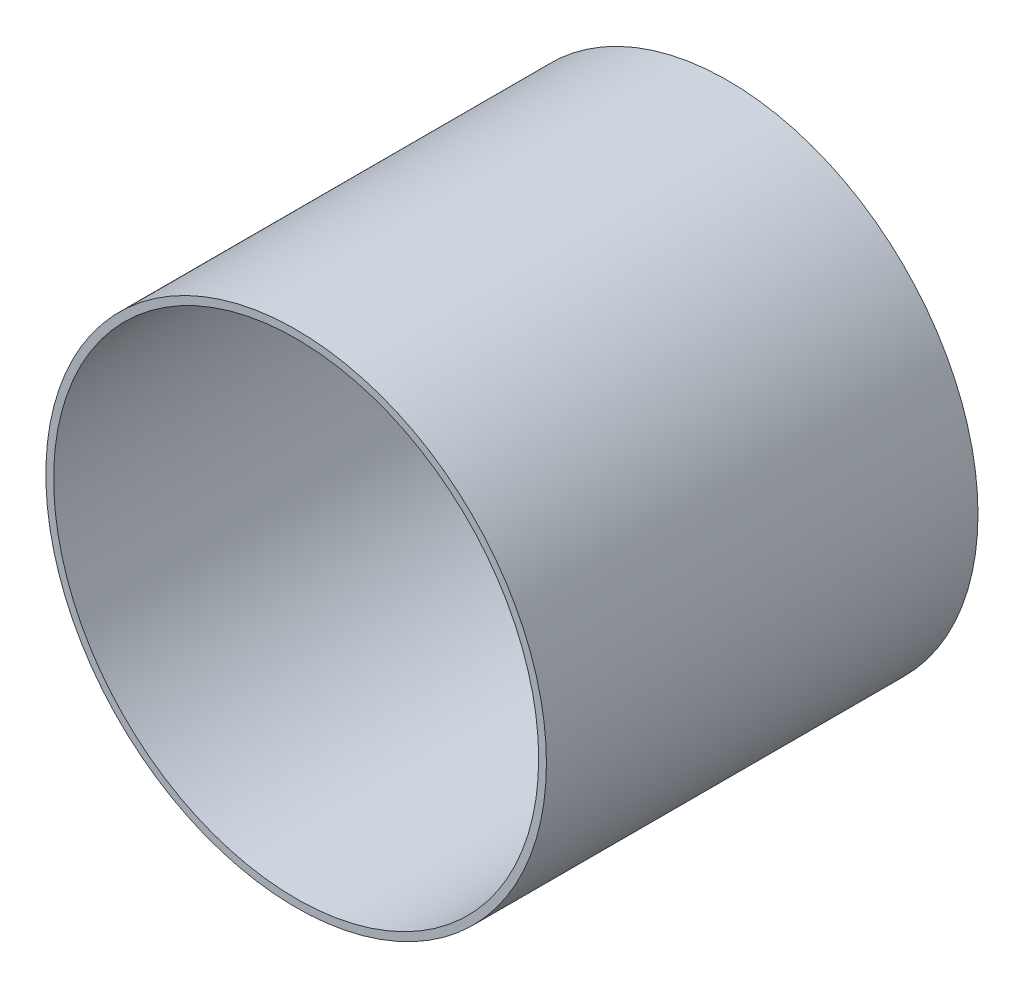
ISO-10303-21;
HEADER;
FILE_DESCRIPTION(('STEP AP214'),'2;1');
FILE_NAME('part.step','',(''),(''),'','','');
FILE_SCHEMA(('AUTOMOTIVE_DESIGN { 1 0 10303 214 1 1 1 1 }'));
ENDSEC;
DATA;
#1=APPLICATION_CONTEXT('core data for automotive mechanical design processes');
#2=APPLICATION_PROTOCOL_DEFINITION('international standard','automotive_design',2000,#1);
#3=PRODUCT_CONTEXT('',#1,'mechanical');
#4=PRODUCT('Part','Part','',(#3));
#5=PRODUCT_RELATED_PRODUCT_CATEGORY('part','',(#4));
#6=PRODUCT_DEFINITION_FORMATION('','',#4);
#7=PRODUCT_DEFINITION_CONTEXT('part definition',#1,'design');
#8=PRODUCT_DEFINITION('design','',#6,#7);
#9=PRODUCT_DEFINITION_SHAPE('','',#8);
#10=(LENGTH_UNIT() NAMED_UNIT(*) SI_UNIT(.MILLI.,.METRE.));
#11=(NAMED_UNIT(*) PLANE_ANGLE_UNIT() SI_UNIT($,.RADIAN.));
#12=(NAMED_UNIT(*) SI_UNIT($,.STERADIAN.) SOLID_ANGLE_UNIT());
#13=UNCERTAINTY_MEASURE_WITH_UNIT(LENGTH_MEASURE(1.E-05),#10,'distance_accuracy_value','');
#14=(GEOMETRIC_REPRESENTATION_CONTEXT(3) GLOBAL_UNCERTAINTY_ASSIGNED_CONTEXT((#13)) GLOBAL_UNIT_ASSIGNED_CONTEXT((#10,
#11,#12)) REPRESENTATION_CONTEXT('',''));
#15=CARTESIAN_POINT('',(0.,0.,0.));
#16=DIRECTION('',(0.,0.,1.));
#17=DIRECTION('',(1.,0.,0.));
#18=AXIS2_PLACEMENT_3D('',#15,#16,#17);
#19=CARTESIAN_POINT('',(0.,0.,25.));
#20=DIRECTION('',(0.,0.,1.));
#21=DIRECTION('',(1.,0.,0.));
#22=AXIS2_PLACEMENT_3D('',#19,#20,#21);
#23=PLANE('',#22);
#24=CARTESIAN_POINT('',(0.,0.,25.));
#25=DIRECTION('',(0.,0.,1.));
#26=DIRECTION('',(1.,0.,0.));
#27=AXIS2_PLACEMENT_3D('',#24,#25,#26);
#28=CIRCLE('',#27,14.5);
#29=CARTESIAN_POINT('',(14.5,0.,25.));
#30=VERTEX_POINT('',#29);
#31=EDGE_CURVE('E10',#30,#30,#28,.T.);
#32=ORIENTED_EDGE('',*,*,#31,.T.);
#33=EDGE_LOOP('',(#32));
#34=FACE_BOUND('',#33,.T.);
#35=CARTESIAN_POINT('',(0.,0.,25.));
#36=DIRECTION('',(0.,0.,1.));
#37=DIRECTION('',(1.,0.,0.));
#38=AXIS2_PLACEMENT_3D('',#35,#36,#37);
#39=CIRCLE('',#38,14.05);
#40=CARTESIAN_POINT('',(14.05,0.,25.));
#41=VERTEX_POINT('',#40);
#42=EDGE_CURVE('E42',#41,#41,#39,.T.);
#43=ORIENTED_EDGE('',*,*,#42,.F.);
#44=EDGE_LOOP('',(#43));
#45=FACE_BOUND('',#44,.T.);
#46=ADVANCED_FACE('F31',(#34,#45),#23,.T.);
#47=CARTESIAN_POINT('',(0.,0.,0.));
#48=DIRECTION('',(0.,0.,1.));
#49=DIRECTION('',(1.,0.,0.));
#50=AXIS2_PLACEMENT_3D('',#47,#48,#49);
#51=PLANE('',#50);
#52=CARTESIAN_POINT('',(0.,0.,0.));
#53=DIRECTION('',(0.,0.,1.));
#54=DIRECTION('',(1.,0.,0.));
#55=AXIS2_PLACEMENT_3D('',#52,#53,#54);
#56=CIRCLE('',#55,14.5);
#57=CARTESIAN_POINT('',(14.5,0.,0.));
#58=VERTEX_POINT('',#57);
#59=EDGE_CURVE('E35',#58,#58,#56,.T.);
#60=ORIENTED_EDGE('',*,*,#59,.F.);
#61=EDGE_LOOP('',(#60));
#62=FACE_BOUND('',#61,.T.);
#63=CARTESIAN_POINT('',(0.,0.,0.));
#64=DIRECTION('',(0.,0.,1.));
#65=DIRECTION('',(1.,0.,0.));
#66=AXIS2_PLACEMENT_3D('',#63,#64,#65);
#67=CIRCLE('',#66,14.05);
#68=CARTESIAN_POINT('',(14.05,0.,0.));
#69=VERTEX_POINT('',#68);
#70=EDGE_CURVE('E44',#69,#69,#67,.T.);
#71=ORIENTED_EDGE('',*,*,#70,.T.);
#72=EDGE_LOOP('',(#71));
#73=FACE_BOUND('',#72,.T.);
#74=ADVANCED_FACE('F54',(#62,#73),#51,.F.);
#75=CARTESIAN_POINT('',(0.,0.,25.));
#76=DIRECTION('',(0.,0.,-1.));
#77=DIRECTION('',(-1.,0.,0.));
#78=AXIS2_PLACEMENT_3D('',#75,#76,#77);
#79=CYLINDRICAL_SURFACE('',#78,14.5);
#80=ORIENTED_EDGE('',*,*,#31,.F.);
#81=EDGE_LOOP('',(#80));
#82=FACE_BOUND('',#81,.T.);
#83=ORIENTED_EDGE('',*,*,#59,.T.);
#84=EDGE_LOOP('',(#83));
#85=FACE_BOUND('',#84,.T.);
#86=ADVANCED_FACE('F33',(#82,#85),#79,.T.);
#87=CARTESIAN_POINT('',(0.,0.,25.));
#88=DIRECTION('',(0.,0.,-1.));
#89=DIRECTION('',(-1.,0.,0.));
#90=AXIS2_PLACEMENT_3D('',#87,#88,#89);
#91=CYLINDRICAL_SURFACE('',#90,14.05);
#92=ORIENTED_EDGE('',*,*,#42,.T.);
#93=EDGE_LOOP('',(#92));
#94=FACE_BOUND('',#93,.T.);
#95=ORIENTED_EDGE('',*,*,#70,.F.);
#96=EDGE_LOOP('',(#95));
#97=FACE_BOUND('',#96,.T.);
#98=ADVANCED_FACE('F50',(#94,#97),#91,.F.);
#99=CLOSED_SHELL('',(#46,#74,#86,#98));
#100=MANIFOLD_SOLID_BREP('B2',#99);
#101=ADVANCED_BREP_SHAPE_REPRESENTATION('',(#18,#100),#14);
#102=SHAPE_DEFINITION_REPRESENTATION(#9,#101);
ENDSEC;
END-ISO-10303-21;
